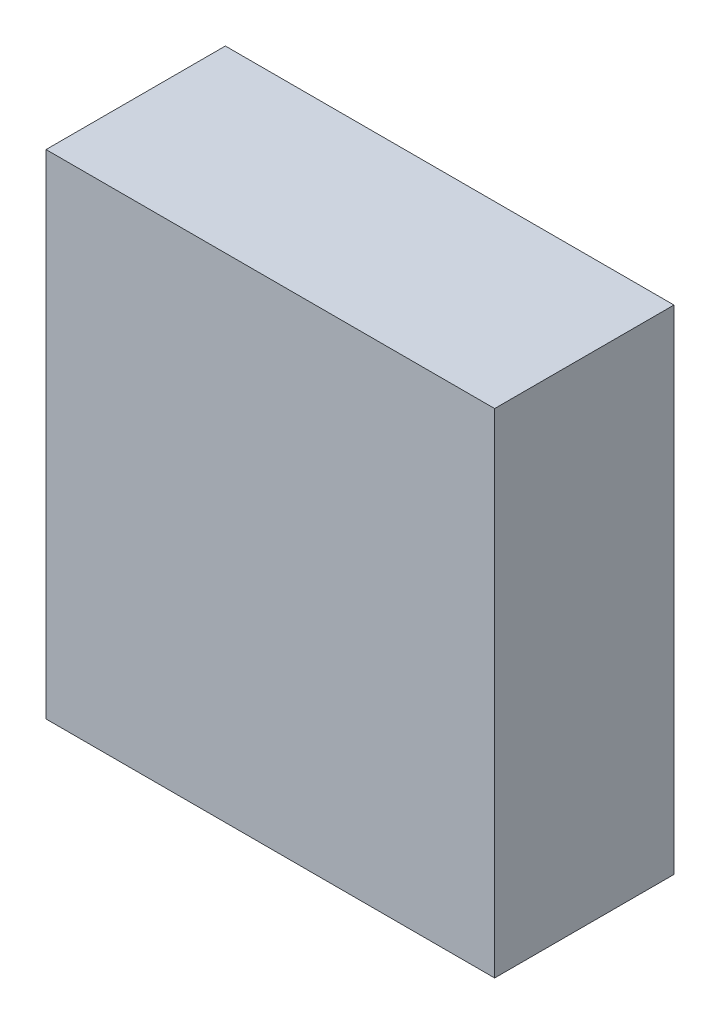
ISO-10303-21;
HEADER;
FILE_DESCRIPTION(('STEP AP214'),'2;1');
FILE_NAME('part.step','',(''),(''),'','','');
FILE_SCHEMA(('AUTOMOTIVE_DESIGN { 1 0 10303 214 1 1 1 1 }'));
ENDSEC;
DATA;
#1=APPLICATION_CONTEXT('core data for automotive mechanical design processes');
#2=APPLICATION_PROTOCOL_DEFINITION('international standard','automotive_design',2000,#1);
#3=PRODUCT_CONTEXT('',#1,'mechanical');
#4=PRODUCT('Part','Part','',(#3));
#5=PRODUCT_RELATED_PRODUCT_CATEGORY('part','',(#4));
#6=PRODUCT_DEFINITION_FORMATION('','',#4);
#7=PRODUCT_DEFINITION_CONTEXT('part definition',#1,'design');
#8=PRODUCT_DEFINITION('design','',#6,#7);
#9=PRODUCT_DEFINITION_SHAPE('','',#8);
#10=(LENGTH_UNIT() NAMED_UNIT(*) SI_UNIT(.MILLI.,.METRE.));
#11=(NAMED_UNIT(*) PLANE_ANGLE_UNIT() SI_UNIT($,.RADIAN.));
#12=(NAMED_UNIT(*) SI_UNIT($,.STERADIAN.) SOLID_ANGLE_UNIT());
#13=UNCERTAINTY_MEASURE_WITH_UNIT(LENGTH_MEASURE(1.E-05),#10,'distance_accuracy_value','');
#14=(GEOMETRIC_REPRESENTATION_CONTEXT(3) GLOBAL_UNCERTAINTY_ASSIGNED_CONTEXT((#13)) GLOBAL_UNIT_ASSIGNED_CONTEXT((#10,
#11,#12)) REPRESENTATION_CONTEXT('',''));
#15=CARTESIAN_POINT('',(0.,0.,0.));
#16=DIRECTION('',(0.,0.,1.));
#17=DIRECTION('',(1.,0.,0.));
#18=AXIS2_PLACEMENT_3D('',#15,#16,#17);
#19=CARTESIAN_POINT('',(-1.3016,-1.2,1.));
#20=DIRECTION('',(1.,0.,0.));
#21=DIRECTION('',(0.,0.,-1.));
#22=AXIS2_PLACEMENT_3D('',#19,#20,#21);
#23=PLANE('',#22);
#24=DIRECTION('',(0.,-1.,0.));
#25=VECTOR('',#24,1.);
#26=CARTESIAN_POINT('',(-1.3016,-1.2,0.));
#27=LINE('',#26,#25);
#28=CARTESIAN_POINT('',(-1.3016,1.55,0.));
#29=VERTEX_POINT('',#28);
#30=CARTESIAN_POINT('',(-1.3016,-1.2,0.));
#31=VERTEX_POINT('',#30);
#32=EDGE_CURVE('E95',#29,#31,#27,.T.);
#33=ORIENTED_EDGE('',*,*,#32,.T.);
#34=DIRECTION('',(0.,0.,-1.));
#35=VECTOR('',#34,1.);
#36=CARTESIAN_POINT('',(-1.3016,-1.2,1.));
#37=LINE('',#36,#35);
#38=CARTESIAN_POINT('',(-1.3016,-1.2,1.));
#39=VERTEX_POINT('',#38);
#40=EDGE_CURVE('E11',#39,#31,#37,.T.);
#41=ORIENTED_EDGE('',*,*,#40,.F.);
#42=DIRECTION('',(0.,-1.,0.));
#43=VECTOR('',#42,1.);
#44=CARTESIAN_POINT('',(-1.3016,-1.2,1.));
#45=LINE('',#44,#43);
#46=CARTESIAN_POINT('',(-1.3016,1.55,1.));
#47=VERTEX_POINT('',#46);
#48=EDGE_CURVE('E83',#47,#39,#45,.T.);
#49=ORIENTED_EDGE('',*,*,#48,.F.);
#50=DIRECTION('',(0.,0.,-1.));
#51=VECTOR('',#50,1.);
#52=CARTESIAN_POINT('',(-1.3016,1.55,1.));
#53=LINE('',#52,#51);
#54=EDGE_CURVE('E91',#47,#29,#53,.T.);
#55=ORIENTED_EDGE('',*,*,#54,.T.);
#56=EDGE_LOOP('',(#33,#41,#49,#55));
#57=FACE_BOUND('',#56,.T.);
#58=ADVANCED_FACE('F32',(#57),#23,.F.);
#59=CARTESIAN_POINT('',(1.2,-1.2,1.));
#60=DIRECTION('',(0.,1.,0.));
#61=DIRECTION('',(0.,0.,1.));
#62=AXIS2_PLACEMENT_3D('',#59,#60,#61);
#63=PLANE('',#62);
#64=DIRECTION('',(1.,0.,0.));
#65=VECTOR('',#64,1.);
#66=CARTESIAN_POINT('',(1.2,-1.2,0.));
#67=LINE('',#66,#65);
#68=CARTESIAN_POINT('',(1.2,-1.2,0.));
#69=VERTEX_POINT('',#68);
#70=EDGE_CURVE('E87',#31,#69,#67,.T.);
#71=ORIENTED_EDGE('',*,*,#70,.T.);
#72=DIRECTION('',(0.,0.,-1.));
#73=VECTOR('',#72,1.);
#74=CARTESIAN_POINT('',(1.2,-1.2,1.));
#75=LINE('',#74,#73);
#76=CARTESIAN_POINT('',(1.2,-1.2,1.));
#77=VERTEX_POINT('',#76);
#78=EDGE_CURVE('E40',#77,#69,#75,.T.);
#79=ORIENTED_EDGE('',*,*,#78,.F.);
#80=DIRECTION('',(1.,0.,0.));
#81=VECTOR('',#80,1.);
#82=CARTESIAN_POINT('',(1.2,-1.2,1.));
#83=LINE('',#82,#81);
#84=EDGE_CURVE('E78',#39,#77,#83,.T.);
#85=ORIENTED_EDGE('',*,*,#84,.F.);
#86=ORIENTED_EDGE('',*,*,#40,.T.);
#87=EDGE_LOOP('',(#71,#79,#85,#86));
#88=FACE_BOUND('',#87,.T.);
#89=ADVANCED_FACE('F86',(#88),#63,.F.);
#90=CARTESIAN_POINT('',(1.2,1.55,1.));
#91=DIRECTION('',(-1.,0.,0.));
#92=DIRECTION('',(0.,0.,1.));
#93=AXIS2_PLACEMENT_3D('',#90,#91,#92);
#94=PLANE('',#93);
#95=DIRECTION('',(0.,1.,0.));
#96=VECTOR('',#95,1.);
#97=CARTESIAN_POINT('',(1.2,1.55,0.));
#98=LINE('',#97,#96);
#99=CARTESIAN_POINT('',(1.2,1.55,0.));
#100=VERTEX_POINT('',#99);
#101=EDGE_CURVE('E65',#69,#100,#98,.T.);
#102=ORIENTED_EDGE('',*,*,#101,.T.);
#103=DIRECTION('',(0.,0.,-1.));
#104=VECTOR('',#103,1.);
#105=CARTESIAN_POINT('',(1.2,1.55,1.));
#106=LINE('',#105,#104);
#107=CARTESIAN_POINT('',(1.2,1.55,1.));
#108=VERTEX_POINT('',#107);
#109=EDGE_CURVE('E88',#108,#100,#106,.T.);
#110=ORIENTED_EDGE('',*,*,#109,.F.);
#111=DIRECTION('',(0.,1.,0.));
#112=VECTOR('',#111,1.);
#113=CARTESIAN_POINT('',(1.2,1.55,1.));
#114=LINE('',#113,#112);
#115=EDGE_CURVE('E81',#77,#108,#114,.T.);
#116=ORIENTED_EDGE('',*,*,#115,.F.);
#117=ORIENTED_EDGE('',*,*,#78,.T.);
#118=EDGE_LOOP('',(#102,#110,#116,#117));
#119=FACE_BOUND('',#118,.T.);
#120=ADVANCED_FACE('F89',(#119),#94,.F.);
#121=CARTESIAN_POINT('',(-1.3016,1.55,1.));
#122=DIRECTION('',(0.,-1.,0.));
#123=DIRECTION('',(0.,0.,-1.));
#124=AXIS2_PLACEMENT_3D('',#121,#122,#123);
#125=PLANE('',#124);
#126=DIRECTION('',(-1.,0.,0.));
#127=VECTOR('',#126,1.);
#128=CARTESIAN_POINT('',(-1.3016,1.55,0.));
#129=LINE('',#128,#127);
#130=EDGE_CURVE('E71',#100,#29,#129,.T.);
#131=ORIENTED_EDGE('',*,*,#130,.T.);
#132=ORIENTED_EDGE('',*,*,#54,.F.);
#133=DIRECTION('',(-1.,0.,0.));
#134=VECTOR('',#133,1.);
#135=CARTESIAN_POINT('',(-1.3016,1.55,1.));
#136=LINE('',#135,#134);
#137=EDGE_CURVE('E48',#108,#47,#136,.T.);
#138=ORIENTED_EDGE('',*,*,#137,.F.);
#139=ORIENTED_EDGE('',*,*,#109,.T.);
#140=EDGE_LOOP('',(#131,#132,#138,#139));
#141=FACE_BOUND('',#140,.T.);
#142=ADVANCED_FACE('F102',(#141),#125,.F.);
#143=CARTESIAN_POINT('',(0.,0.,1.));
#144=DIRECTION('',(0.,0.,-1.));
#145=DIRECTION('',(-1.,0.,0.));
#146=AXIS2_PLACEMENT_3D('',#143,#144,#145);
#147=PLANE('',#146);
#148=ORIENTED_EDGE('',*,*,#48,.T.);
#149=ORIENTED_EDGE('',*,*,#84,.T.);
#150=ORIENTED_EDGE('',*,*,#115,.T.);
#151=ORIENTED_EDGE('',*,*,#137,.T.);
#152=EDGE_LOOP('',(#148,#149,#150,#151));
#153=FACE_BOUND('',#152,.T.);
#154=ADVANCED_FACE('F79',(#153),#147,.F.);
#155=CARTESIAN_POINT('',(0.,0.,0.));
#156=DIRECTION('',(0.,0.,-1.));
#157=DIRECTION('',(-1.,0.,0.));
#158=AXIS2_PLACEMENT_3D('',#155,#156,#157);
#159=PLANE('',#158);
#160=ORIENTED_EDGE('',*,*,#32,.F.);
#161=ORIENTED_EDGE('',*,*,#130,.F.);
#162=ORIENTED_EDGE('',*,*,#101,.F.);
#163=ORIENTED_EDGE('',*,*,#70,.F.);
#164=EDGE_LOOP('',(#160,#161,#162,#163));
#165=FACE_BOUND('',#164,.T.);
#166=ADVANCED_FACE('F105',(#165),#159,.T.);
#167=CLOSED_SHELL('',(#58,#89,#120,#142,#154,#166));
#168=MANIFOLD_SOLID_BREP('B2',#167);
#169=ADVANCED_BREP_SHAPE_REPRESENTATION('',(#18,#168),#14);
#170=SHAPE_DEFINITION_REPRESENTATION(#9,#169);
ENDSEC;
END-ISO-10303-21;
